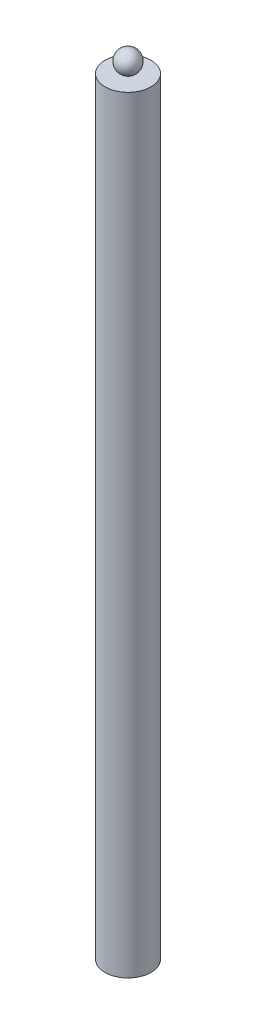
ISO-10303-21;
HEADER;
FILE_DESCRIPTION(('STEP AP214'),'2;1');
FILE_NAME('part.step','',(''),(''),'','','');
FILE_SCHEMA(('AUTOMOTIVE_DESIGN { 1 0 10303 214 1 1 1 1 }'));
ENDSEC;
DATA;
#1=APPLICATION_CONTEXT('core data for automotive mechanical design processes');
#2=APPLICATION_PROTOCOL_DEFINITION('international standard','automotive_design',2000,#1);
#3=PRODUCT_CONTEXT('',#1,'mechanical');
#4=PRODUCT('Part','Part','',(#3));
#5=PRODUCT_RELATED_PRODUCT_CATEGORY('part','',(#4));
#6=PRODUCT_DEFINITION_FORMATION('','',#4);
#7=PRODUCT_DEFINITION_CONTEXT('part definition',#1,'design');
#8=PRODUCT_DEFINITION('design','',#6,#7);
#9=PRODUCT_DEFINITION_SHAPE('','',#8);
#10=(LENGTH_UNIT() NAMED_UNIT(*) SI_UNIT(.MILLI.,.METRE.));
#11=(NAMED_UNIT(*) PLANE_ANGLE_UNIT() SI_UNIT($,.RADIAN.));
#12=(NAMED_UNIT(*) SI_UNIT($,.STERADIAN.) SOLID_ANGLE_UNIT());
#13=UNCERTAINTY_MEASURE_WITH_UNIT(LENGTH_MEASURE(1.E-05),#10,'distance_accuracy_value','');
#14=(GEOMETRIC_REPRESENTATION_CONTEXT(3) GLOBAL_UNCERTAINTY_ASSIGNED_CONTEXT((#13)) GLOBAL_UNIT_ASSIGNED_CONTEXT((#10,
#11,#12)) REPRESENTATION_CONTEXT('',''));
#15=CARTESIAN_POINT('',(0.,0.,0.));
#16=DIRECTION('',(0.,0.,1.));
#17=DIRECTION('',(1.,0.,0.));
#18=AXIS2_PLACEMENT_3D('',#15,#16,#17);
#19=CARTESIAN_POINT('',(0.,5070.,0.));
#20=DIRECTION('',(-0.412893202811617,0.,-0.910779448094853));
#21=DIRECTION('',(0.910779448094853,0.,-0.412893202811617));
#22=AXIS2_PLACEMENT_3D('',#19,#20,#21);
#23=SPHERICAL_SURFACE('',#22,69.999999954);
#24=CARTESIAN_POINT('',(-28.9025241778201,5070.,-63.7545613247439));
#25=VERTEX_POINT('',#24);
#26=VERTEX_LOOP('',#25);
#27=FACE_BOUND('',#26,.T.);
#28=ADVANCED_FACE('F37',(#27),#23,.T.);
#29=CLOSED_SHELL('',(#28));
#30=MANIFOLD_SOLID_BREP('B2',#29);
#31=CARTESIAN_POINT('',(0.,5000.,0.));
#32=DIRECTION('',(0.,-1.,0.));
#33=DIRECTION('',(0.,0.,-1.));
#34=AXIS2_PLACEMENT_3D('',#31,#32,#33);
#35=CYLINDRICAL_SURFACE('',#34,150.);
#36=CARTESIAN_POINT('',(0.,5000.,0.));
#37=DIRECTION('',(0.,1.,0.));
#38=DIRECTION('',(0.,0.,1.));
#39=AXIS2_PLACEMENT_3D('',#36,#37,#38);
#40=CIRCLE('',#39,150.);
#41=CARTESIAN_POINT('',(0.,5000.,150.));
#42=VERTEX_POINT('',#41);
#43=EDGE_CURVE('E36',#42,#42,#40,.T.);
#44=ORIENTED_EDGE('',*,*,#43,.F.);
#45=EDGE_LOOP('',(#44));
#46=FACE_BOUND('',#45,.T.);
#47=CARTESIAN_POINT('',(0.,0.,0.));
#48=DIRECTION('',(0.,1.,0.));
#49=DIRECTION('',(0.,0.,1.));
#50=AXIS2_PLACEMENT_3D('',#47,#48,#49);
#51=CIRCLE('',#50,150.);
#52=CARTESIAN_POINT('',(0.,0.,150.));
#53=VERTEX_POINT('',#52);
#54=EDGE_CURVE('E53',#53,#53,#51,.T.);
#55=ORIENTED_EDGE('',*,*,#54,.T.);
#56=EDGE_LOOP('',(#55));
#57=FACE_BOUND('',#56,.T.);
#58=ADVANCED_FACE('F50',(#46,#57),#35,.T.);
#59=CARTESIAN_POINT('',(0.,5000.,0.));
#60=DIRECTION('',(0.,1.,0.));
#61=DIRECTION('',(0.,0.,1.));
#62=AXIS2_PLACEMENT_3D('',#59,#60,#61);
#63=PLANE('',#62);
#64=ORIENTED_EDGE('',*,*,#43,.T.);
#65=EDGE_LOOP('',(#64));
#66=FACE_BOUND('',#65,.T.);
#67=ADVANCED_FACE('F65',(#66),#63,.T.);
#68=CARTESIAN_POINT('',(0.,0.,0.));
#69=DIRECTION('',(0.,1.,0.));
#70=DIRECTION('',(0.,0.,1.));
#71=AXIS2_PLACEMENT_3D('',#68,#69,#70);
#72=PLANE('',#71);
#73=ORIENTED_EDGE('',*,*,#54,.F.);
#74=EDGE_LOOP('',(#73));
#75=FACE_BOUND('',#74,.T.);
#76=ADVANCED_FACE('F63',(#75),#72,.F.);
#77=CLOSED_SHELL('',(#58,#67,#76));
#78=MANIFOLD_SOLID_BREP('B6',#77);
#79=ADVANCED_BREP_SHAPE_REPRESENTATION('',(#18,#30,#78),#14);
#80=SHAPE_DEFINITION_REPRESENTATION(#9,#79);
ENDSEC;
END-ISO-10303-21;
